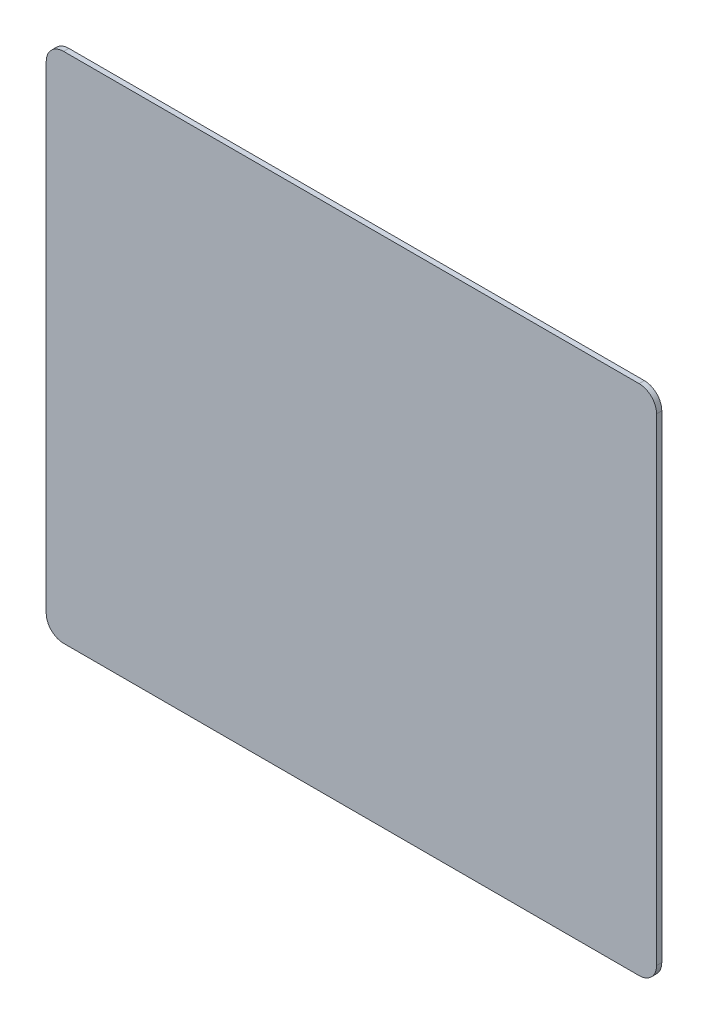
ISO-10303-21;
HEADER;
FILE_DESCRIPTION(('STEP AP214'),'2;1');
FILE_NAME('part.step','',(''),(''),'','','');
FILE_SCHEMA(('AUTOMOTIVE_DESIGN { 1 0 10303 214 1 1 1 1 }'));
ENDSEC;
DATA;
#1=APPLICATION_CONTEXT('core data for automotive mechanical design processes');
#2=APPLICATION_PROTOCOL_DEFINITION('international standard','automotive_design',2000,#1);
#3=PRODUCT_CONTEXT('',#1,'mechanical');
#4=PRODUCT('Part','Part','',(#3));
#5=PRODUCT_RELATED_PRODUCT_CATEGORY('part','',(#4));
#6=PRODUCT_DEFINITION_FORMATION('','',#4);
#7=PRODUCT_DEFINITION_CONTEXT('part definition',#1,'design');
#8=PRODUCT_DEFINITION('design','',#6,#7);
#9=PRODUCT_DEFINITION_SHAPE('','',#8);
#10=(LENGTH_UNIT() NAMED_UNIT(*) SI_UNIT(.MILLI.,.METRE.));
#11=(NAMED_UNIT(*) PLANE_ANGLE_UNIT() SI_UNIT($,.RADIAN.));
#12=(NAMED_UNIT(*) SI_UNIT($,.STERADIAN.) SOLID_ANGLE_UNIT());
#13=UNCERTAINTY_MEASURE_WITH_UNIT(LENGTH_MEASURE(1.E-05),#10,'distance_accuracy_value','');
#14=(GEOMETRIC_REPRESENTATION_CONTEXT(3) GLOBAL_UNCERTAINTY_ASSIGNED_CONTEXT((#13)) GLOBAL_UNIT_ASSIGNED_CONTEXT((#10,
#11,#12)) REPRESENTATION_CONTEXT('',''));
#15=CARTESIAN_POINT('',(0.,0.,0.));
#16=DIRECTION('',(0.,0.,1.));
#17=DIRECTION('',(1.,0.,0.));
#18=AXIS2_PLACEMENT_3D('',#15,#16,#17);
#19=CARTESIAN_POINT('',(350.,-294.,6.));
#20=DIRECTION('',(-1.,0.,0.));
#21=DIRECTION('',(0.,0.,1.));
#22=AXIS2_PLACEMENT_3D('',#19,#20,#21);
#23=PLANE('',#22);
#24=DIRECTION('',(0.,1.,0.));
#25=VECTOR('',#24,1.);
#26=CARTESIAN_POINT('',(350.,-294.,0.));
#27=LINE('',#26,#25);
#28=CARTESIAN_POINT('',(350.,-274.,0.));
#29=VERTEX_POINT('',#28);
#30=CARTESIAN_POINT('',(350.,274.,0.));
#31=VERTEX_POINT('',#30);
#32=EDGE_CURVE('E149',#29,#31,#27,.T.);
#33=ORIENTED_EDGE('',*,*,#32,.T.);
#34=DIRECTION('',(0.,0.,-1.));
#35=VECTOR('',#34,1.);
#36=CARTESIAN_POINT('',(350.,274.,6.));
#37=LINE('',#36,#35);
#38=CARTESIAN_POINT('',(350.,274.,6.));
#39=VERTEX_POINT('',#38);
#40=EDGE_CURVE('E183',#31,#39,#37,.F.);
#41=ORIENTED_EDGE('',*,*,#40,.T.);
#42=DIRECTION('',(0.,1.,0.));
#43=VECTOR('',#42,1.);
#44=CARTESIAN_POINT('',(350.,-294.,6.));
#45=LINE('',#44,#43);
#46=CARTESIAN_POINT('',(350.,-274.,6.));
#47=VERTEX_POINT('',#46);
#48=EDGE_CURVE('E147',#47,#39,#45,.T.);
#49=ORIENTED_EDGE('',*,*,#48,.F.);
#50=DIRECTION('',(0.,0.,-1.));
#51=VECTOR('',#50,1.);
#52=CARTESIAN_POINT('',(350.,-274.,6.));
#53=LINE('',#52,#51);
#54=EDGE_CURVE('E179',#47,#29,#53,.T.);
#55=ORIENTED_EDGE('',*,*,#54,.T.);
#56=EDGE_LOOP('',(#33,#41,#49,#55));
#57=FACE_BOUND('',#56,.T.);
#58=ADVANCED_FACE('F47',(#57),#23,.F.);
#59=CARTESIAN_POINT('',(-350.,294.,6.));
#60=DIRECTION('',(0.,-1.,0.));
#61=DIRECTION('',(0.,0.,-1.));
#62=AXIS2_PLACEMENT_3D('',#59,#60,#61);
#63=PLANE('',#62);
#64=DIRECTION('',(-1.,0.,0.));
#65=VECTOR('',#64,1.);
#66=CARTESIAN_POINT('',(-350.,294.,0.));
#67=LINE('',#66,#65);
#68=CARTESIAN_POINT('',(330.,294.,0.));
#69=VERTEX_POINT('',#68);
#70=CARTESIAN_POINT('',(-330.,294.,0.));
#71=VERTEX_POINT('',#70);
#72=EDGE_CURVE('E142',#69,#71,#67,.T.);
#73=ORIENTED_EDGE('',*,*,#72,.T.);
#74=DIRECTION('',(0.,0.,-1.));
#75=VECTOR('',#74,1.);
#76=CARTESIAN_POINT('',(-330.,294.,6.));
#77=LINE('',#76,#75);
#78=CARTESIAN_POINT('',(-330.,294.,6.));
#79=VERTEX_POINT('',#78);
#80=EDGE_CURVE('E118',#71,#79,#77,.F.);
#81=ORIENTED_EDGE('',*,*,#80,.T.);
#82=DIRECTION('',(-1.,0.,0.));
#83=VECTOR('',#82,1.);
#84=CARTESIAN_POINT('',(-350.,294.,6.));
#85=LINE('',#84,#83);
#86=CARTESIAN_POINT('',(330.,294.,6.));
#87=VERTEX_POINT('',#86);
#88=EDGE_CURVE('E203',#87,#79,#85,.T.);
#89=ORIENTED_EDGE('',*,*,#88,.F.);
#90=DIRECTION('',(0.,0.,-1.));
#91=VECTOR('',#90,1.);
#92=CARTESIAN_POINT('',(330.,294.,6.));
#93=LINE('',#92,#91);
#94=EDGE_CURVE('E124',#87,#69,#93,.T.);
#95=ORIENTED_EDGE('',*,*,#94,.T.);
#96=EDGE_LOOP('',(#73,#81,#89,#95));
#97=FACE_BOUND('',#96,.T.);
#98=ADVANCED_FACE('F270',(#97),#63,.F.);
#99=CARTESIAN_POINT('',(-350.,-294.,6.));
#100=DIRECTION('',(1.,0.,0.));
#101=DIRECTION('',(0.,0.,-1.));
#102=AXIS2_PLACEMENT_3D('',#99,#100,#101);
#103=PLANE('',#102);
#104=DIRECTION('',(0.,-1.,0.));
#105=VECTOR('',#104,1.);
#106=CARTESIAN_POINT('',(-350.,-294.,6.));
#107=LINE('',#106,#105);
#108=CARTESIAN_POINT('',(-350.,274.,6.));
#109=VERTEX_POINT('',#108);
#110=CARTESIAN_POINT('',(-350.,-274.,6.));
#111=VERTEX_POINT('',#110);
#112=EDGE_CURVE('E133',#109,#111,#107,.T.);
#113=ORIENTED_EDGE('',*,*,#112,.F.);
#114=DIRECTION('',(0.,0.,-1.));
#115=VECTOR('',#114,1.);
#116=CARTESIAN_POINT('',(-350.,274.,6.));
#117=LINE('',#116,#115);
#118=CARTESIAN_POINT('',(-350.,274.,0.));
#119=VERTEX_POINT('',#118);
#120=EDGE_CURVE('E117',#109,#119,#117,.T.);
#121=ORIENTED_EDGE('',*,*,#120,.T.);
#122=DIRECTION('',(0.,-1.,0.));
#123=VECTOR('',#122,1.);
#124=CARTESIAN_POINT('',(-350.,-294.,0.));
#125=LINE('',#124,#123);
#126=CARTESIAN_POINT('',(-350.,-274.,0.));
#127=VERTEX_POINT('',#126);
#128=EDGE_CURVE('E131',#119,#127,#125,.T.);
#129=ORIENTED_EDGE('',*,*,#128,.T.);
#130=DIRECTION('',(0.,0.,-1.));
#131=VECTOR('',#130,1.);
#132=CARTESIAN_POINT('',(-350.,-274.,6.));
#133=LINE('',#132,#131);
#134=EDGE_CURVE('E136',#127,#111,#133,.F.);
#135=ORIENTED_EDGE('',*,*,#134,.T.);
#136=EDGE_LOOP('',(#113,#121,#129,#135));
#137=FACE_BOUND('',#136,.T.);
#138=ADVANCED_FACE('F130',(#137),#103,.F.);
#139=CARTESIAN_POINT('',(-350.,-294.,6.));
#140=DIRECTION('',(0.,1.,0.));
#141=DIRECTION('',(0.,0.,1.));
#142=AXIS2_PLACEMENT_3D('',#139,#140,#141);
#143=PLANE('',#142);
#144=DIRECTION('',(1.,0.,0.));
#145=VECTOR('',#144,1.);
#146=CARTESIAN_POINT('',(-350.,-294.,0.));
#147=LINE('',#146,#145);
#148=CARTESIAN_POINT('',(-330.,-294.,0.));
#149=VERTEX_POINT('',#148);
#150=CARTESIAN_POINT('',(330.,-294.,0.));
#151=VERTEX_POINT('',#150);
#152=EDGE_CURVE('E141',#149,#151,#147,.T.);
#153=ORIENTED_EDGE('',*,*,#152,.T.);
#154=DIRECTION('',(0.,0.,-1.));
#155=VECTOR('',#154,1.);
#156=CARTESIAN_POINT('',(330.,-294.,6.));
#157=LINE('',#156,#155);
#158=CARTESIAN_POINT('',(330.,-294.,6.));
#159=VERTEX_POINT('',#158);
#160=EDGE_CURVE('E11',#151,#159,#157,.F.);
#161=ORIENTED_EDGE('',*,*,#160,.T.);
#162=DIRECTION('',(1.,0.,0.));
#163=VECTOR('',#162,1.);
#164=CARTESIAN_POINT('',(-350.,-294.,6.));
#165=LINE('',#164,#163);
#166=CARTESIAN_POINT('',(-330.,-294.,6.));
#167=VERTEX_POINT('',#166);
#168=EDGE_CURVE('E154',#167,#159,#165,.T.);
#169=ORIENTED_EDGE('',*,*,#168,.F.);
#170=DIRECTION('',(0.,0.,-1.));
#171=VECTOR('',#170,1.);
#172=CARTESIAN_POINT('',(-330.,-294.,6.));
#173=LINE('',#172,#171);
#174=EDGE_CURVE('E56',#167,#149,#173,.T.);
#175=ORIENTED_EDGE('',*,*,#174,.T.);
#176=EDGE_LOOP('',(#153,#161,#169,#175));
#177=FACE_BOUND('',#176,.T.);
#178=ADVANCED_FACE('F189',(#177),#143,.F.);
#179=CARTESIAN_POINT('',(0.,0.,6.));
#180=DIRECTION('',(0.,0.,-1.));
#181=DIRECTION('',(-1.,0.,0.));
#182=AXIS2_PLACEMENT_3D('',#179,#180,#181);
#183=PLANE('',#182);
#184=ORIENTED_EDGE('',*,*,#88,.T.);
#185=CARTESIAN_POINT('',(-330.,274.,6.));
#186=DIRECTION('',(0.,0.,-1.));
#187=DIRECTION('',(-1.,0.,0.));
#188=AXIS2_PLACEMENT_3D('',#185,#186,#187);
#189=CIRCLE('',#188,20.);
#190=EDGE_CURVE('E176',#79,#109,#189,.F.);
#191=ORIENTED_EDGE('',*,*,#190,.T.);
#192=ORIENTED_EDGE('',*,*,#112,.T.);
#193=CARTESIAN_POINT('',(-330.,-274.,6.));
#194=DIRECTION('',(0.,0.,-1.));
#195=DIRECTION('',(-1.,0.,0.));
#196=AXIS2_PLACEMENT_3D('',#193,#194,#195);
#197=CIRCLE('',#196,20.);
#198=EDGE_CURVE('E68',#111,#167,#197,.F.);
#199=ORIENTED_EDGE('',*,*,#198,.T.);
#200=ORIENTED_EDGE('',*,*,#168,.T.);
#201=CARTESIAN_POINT('',(330.,-274.,6.));
#202=DIRECTION('',(0.,0.,-1.));
#203=DIRECTION('',(-1.,0.,0.));
#204=AXIS2_PLACEMENT_3D('',#201,#202,#203);
#205=CIRCLE('',#204,20.);
#206=EDGE_CURVE('E170',#159,#47,#205,.F.);
#207=ORIENTED_EDGE('',*,*,#206,.T.);
#208=ORIENTED_EDGE('',*,*,#48,.T.);
#209=CARTESIAN_POINT('',(330.,274.,6.));
#210=DIRECTION('',(0.,0.,-1.));
#211=DIRECTION('',(-1.,0.,0.));
#212=AXIS2_PLACEMENT_3D('',#209,#210,#211);
#213=CIRCLE('',#212,20.);
#214=EDGE_CURVE('E173',#39,#87,#213,.F.);
#215=ORIENTED_EDGE('',*,*,#214,.T.);
#216=EDGE_LOOP('',(#184,#191,#192,#199,#200,#207,#208,#215));
#217=FACE_BOUND('',#216,.T.);
#218=ADVANCED_FACE('F259',(#217),#183,.F.);
#219=CARTESIAN_POINT('',(0.,0.,0.));
#220=DIRECTION('',(0.,0.,-1.));
#221=DIRECTION('',(-1.,0.,0.));
#222=AXIS2_PLACEMENT_3D('',#219,#220,#221);
#223=PLANE('',#222);
#224=ORIENTED_EDGE('',*,*,#128,.F.);
#225=CARTESIAN_POINT('',(-330.,274.,0.));
#226=DIRECTION('',(0.,0.,-1.));
#227=DIRECTION('',(-1.,0.,0.));
#228=AXIS2_PLACEMENT_3D('',#225,#226,#227);
#229=CIRCLE('',#228,20.);
#230=EDGE_CURVE('E113',#119,#71,#229,.T.);
#231=ORIENTED_EDGE('',*,*,#230,.T.);
#232=ORIENTED_EDGE('',*,*,#72,.F.);
#233=CARTESIAN_POINT('',(330.,274.,0.));
#234=DIRECTION('',(0.,0.,-1.));
#235=DIRECTION('',(-1.,0.,0.));
#236=AXIS2_PLACEMENT_3D('',#233,#234,#235);
#237=CIRCLE('',#236,20.);
#238=EDGE_CURVE('E125',#69,#31,#237,.T.);
#239=ORIENTED_EDGE('',*,*,#238,.T.);
#240=ORIENTED_EDGE('',*,*,#32,.F.);
#241=CARTESIAN_POINT('',(330.,-274.,0.));
#242=DIRECTION('',(0.,0.,-1.));
#243=DIRECTION('',(-1.,0.,0.));
#244=AXIS2_PLACEMENT_3D('',#241,#242,#243);
#245=CIRCLE('',#244,20.);
#246=EDGE_CURVE('E158',#29,#151,#245,.T.);
#247=ORIENTED_EDGE('',*,*,#246,.T.);
#248=ORIENTED_EDGE('',*,*,#152,.F.);
#249=CARTESIAN_POINT('',(-330.,-274.,0.));
#250=DIRECTION('',(0.,0.,-1.));
#251=DIRECTION('',(-1.,0.,0.));
#252=AXIS2_PLACEMENT_3D('',#249,#250,#251);
#253=CIRCLE('',#252,20.);
#254=EDGE_CURVE('E135',#149,#127,#253,.T.);
#255=ORIENTED_EDGE('',*,*,#254,.T.);
#256=EDGE_LOOP('',(#224,#231,#232,#239,#240,#247,#248,#255));
#257=FACE_BOUND('',#256,.T.);
#258=ADVANCED_FACE('F138',(#257),#223,.T.);
#259=CARTESIAN_POINT('',(-330.,274.,6.));
#260=DIRECTION('',(0.,0.,-1.));
#261=DIRECTION('',(-1.,0.,0.));
#262=AXIS2_PLACEMENT_3D('',#259,#260,#261);
#263=CYLINDRICAL_SURFACE('',#262,20.);
#264=ORIENTED_EDGE('',*,*,#190,.F.);
#265=ORIENTED_EDGE('',*,*,#80,.F.);
#266=ORIENTED_EDGE('',*,*,#230,.F.);
#267=ORIENTED_EDGE('',*,*,#120,.F.);
#268=EDGE_LOOP('',(#264,#265,#266,#267));
#269=FACE_BOUND('',#268,.T.);
#270=ADVANCED_FACE('F116',(#269),#263,.T.);
#271=CARTESIAN_POINT('',(330.,274.,6.));
#272=DIRECTION('',(0.,0.,-1.));
#273=DIRECTION('',(-1.,0.,0.));
#274=AXIS2_PLACEMENT_3D('',#271,#272,#273);
#275=CYLINDRICAL_SURFACE('',#274,20.);
#276=ORIENTED_EDGE('',*,*,#214,.F.);
#277=ORIENTED_EDGE('',*,*,#40,.F.);
#278=ORIENTED_EDGE('',*,*,#238,.F.);
#279=ORIENTED_EDGE('',*,*,#94,.F.);
#280=EDGE_LOOP('',(#276,#277,#278,#279));
#281=FACE_BOUND('',#280,.T.);
#282=ADVANCED_FACE('F281',(#281),#275,.T.);
#283=CARTESIAN_POINT('',(330.,-274.,6.));
#284=DIRECTION('',(0.,0.,-1.));
#285=DIRECTION('',(-1.,0.,0.));
#286=AXIS2_PLACEMENT_3D('',#283,#284,#285);
#287=CYLINDRICAL_SURFACE('',#286,20.);
#288=ORIENTED_EDGE('',*,*,#206,.F.);
#289=ORIENTED_EDGE('',*,*,#160,.F.);
#290=ORIENTED_EDGE('',*,*,#246,.F.);
#291=ORIENTED_EDGE('',*,*,#54,.F.);
#292=EDGE_LOOP('',(#288,#289,#290,#291));
#293=FACE_BOUND('',#292,.T.);
#294=ADVANCED_FACE('F196',(#293),#287,.T.);
#295=CARTESIAN_POINT('',(-330.,-274.,6.));
#296=DIRECTION('',(0.,0.,-1.));
#297=DIRECTION('',(-1.,0.,0.));
#298=AXIS2_PLACEMENT_3D('',#295,#296,#297);
#299=CYLINDRICAL_SURFACE('',#298,20.);
#300=ORIENTED_EDGE('',*,*,#198,.F.);
#301=ORIENTED_EDGE('',*,*,#134,.F.);
#302=ORIENTED_EDGE('',*,*,#254,.F.);
#303=ORIENTED_EDGE('',*,*,#174,.F.);
#304=EDGE_LOOP('',(#300,#301,#302,#303));
#305=FACE_BOUND('',#304,.T.);
#306=ADVANCED_FACE('F49',(#305),#299,.T.);
#307=CLOSED_SHELL('',(#58,#98,#138,#178,#218,#258,#270,#282,#294,#306));
#308=MANIFOLD_SOLID_BREP('B2',#307);
#309=ADVANCED_BREP_SHAPE_REPRESENTATION('',(#18,#308),#14);
#310=SHAPE_DEFINITION_REPRESENTATION(#9,#309);
ENDSEC;
END-ISO-10303-21;
